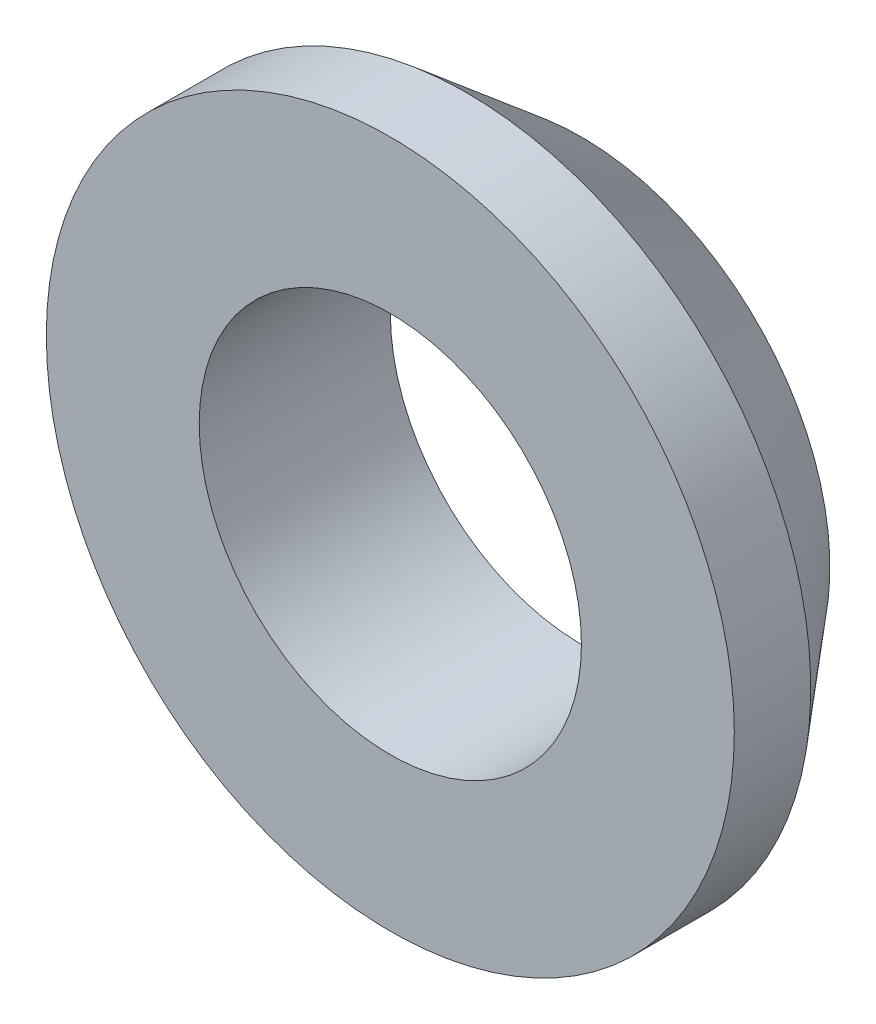
ISO-10303-21;
HEADER;
FILE_DESCRIPTION(('STEP AP214'),'2;1');
FILE_NAME('part.step','',(''),(''),'','','');
FILE_SCHEMA(('AUTOMOTIVE_DESIGN { 1 0 10303 214 1 1 1 1 }'));
ENDSEC;
DATA;
#1=APPLICATION_CONTEXT('core data for automotive mechanical design processes');
#2=APPLICATION_PROTOCOL_DEFINITION('international standard','automotive_design',2000,#1);
#3=PRODUCT_CONTEXT('',#1,'mechanical');
#4=PRODUCT('Part','Part','',(#3));
#5=PRODUCT_RELATED_PRODUCT_CATEGORY('part','',(#4));
#6=PRODUCT_DEFINITION_FORMATION('','',#4);
#7=PRODUCT_DEFINITION_CONTEXT('part definition',#1,'design');
#8=PRODUCT_DEFINITION('design','',#6,#7);
#9=PRODUCT_DEFINITION_SHAPE('','',#8);
#10=(LENGTH_UNIT() NAMED_UNIT(*) SI_UNIT(.MILLI.,.METRE.));
#11=(NAMED_UNIT(*) PLANE_ANGLE_UNIT() SI_UNIT($,.RADIAN.));
#12=(NAMED_UNIT(*) SI_UNIT($,.STERADIAN.) SOLID_ANGLE_UNIT());
#13=UNCERTAINTY_MEASURE_WITH_UNIT(LENGTH_MEASURE(1.E-05),#10,'distance_accuracy_value','');
#14=(GEOMETRIC_REPRESENTATION_CONTEXT(3) GLOBAL_UNCERTAINTY_ASSIGNED_CONTEXT((#13)) GLOBAL_UNIT_ASSIGNED_CONTEXT((#10,
#11,#12)) REPRESENTATION_CONTEXT('',''));
#15=CARTESIAN_POINT('',(0.,0.,0.));
#16=DIRECTION('',(0.,0.,1.));
#17=DIRECTION('',(1.,0.,0.));
#18=AXIS2_PLACEMENT_3D('',#15,#16,#17);
#19=CARTESIAN_POINT('',(0.,0.,2.));
#20=DIRECTION('',(0.,0.,1.));
#21=DIRECTION('',(1.,0.,0.));
#22=AXIS2_PLACEMENT_3D('',#19,#20,#21);
#23=PLANE('',#22);
#24=CARTESIAN_POINT('',(0.,0.,2.));
#25=DIRECTION('',(0.,0.,1.));
#26=DIRECTION('',(1.,0.,0.));
#27=AXIS2_PLACEMENT_3D('',#24,#25,#26);
#28=CIRCLE('',#27,9.);
#29=CARTESIAN_POINT('',(9.,0.,2.));
#30=VERTEX_POINT('',#29);
#31=EDGE_CURVE('E11',#30,#30,#28,.T.);
#32=ORIENTED_EDGE('',*,*,#31,.T.);
#33=EDGE_LOOP('',(#32));
#34=FACE_BOUND('',#33,.T.);
#35=CARTESIAN_POINT('',(0.,0.,2.));
#36=DIRECTION('',(0.,0.,1.));
#37=DIRECTION('',(1.,0.,0.));
#38=AXIS2_PLACEMENT_3D('',#35,#36,#37);
#39=CIRCLE('',#38,5.);
#40=CARTESIAN_POINT('',(5.,0.,2.));
#41=VERTEX_POINT('',#40);
#42=EDGE_CURVE('E40',#41,#41,#39,.T.);
#43=ORIENTED_EDGE('',*,*,#42,.F.);
#44=EDGE_LOOP('',(#43));
#45=FACE_BOUND('',#44,.T.);
#46=ADVANCED_FACE('F33',(#34,#45),#23,.T.);
#47=CARTESIAN_POINT('',(0.,0.,2.));
#48=DIRECTION('',(0.,0.,-1.));
#49=DIRECTION('',(-1.,0.,0.));
#50=AXIS2_PLACEMENT_3D('',#47,#48,#49);
#51=CYLINDRICAL_SURFACE('',#50,9.);
#52=ORIENTED_EDGE('',*,*,#31,.F.);
#53=EDGE_LOOP('',(#52));
#54=FACE_BOUND('',#53,.T.);
#55=CARTESIAN_POINT('',(0.,0.,0.));
#56=DIRECTION('',(0.,0.,-1.));
#57=DIRECTION('',(-1.,0.,0.));
#58=AXIS2_PLACEMENT_3D('',#55,#56,#57);
#59=CIRCLE('',#58,9.);
#60=CARTESIAN_POINT('',(-9.,0.,0.));
#61=VERTEX_POINT('',#60);
#62=EDGE_CURVE('E48',#61,#61,#59,.T.);
#63=ORIENTED_EDGE('',*,*,#62,.F.);
#64=EDGE_LOOP('',(#63));
#65=FACE_BOUND('',#64,.T.);
#66=ADVANCED_FACE('F35',(#54,#65),#51,.T.);
#67=CARTESIAN_POINT('',(0.,0.,2.));
#68=DIRECTION('',(0.,0.,-1.));
#69=DIRECTION('',(-1.,0.,0.));
#70=AXIS2_PLACEMENT_3D('',#67,#68,#69);
#71=CYLINDRICAL_SURFACE('',#70,5.);
#72=ORIENTED_EDGE('',*,*,#42,.T.);
#73=EDGE_LOOP('',(#72));
#74=FACE_BOUND('',#73,.T.);
#75=CARTESIAN_POINT('',(0.,0.,-3.));
#76=DIRECTION('',(0.,0.,-1.));
#77=DIRECTION('',(-1.,0.,0.));
#78=AXIS2_PLACEMENT_3D('',#75,#76,#77);
#79=CIRCLE('',#78,5.);
#80=CARTESIAN_POINT('',(-5.,0.,-3.));
#81=VERTEX_POINT('',#80);
#82=EDGE_CURVE('E85',#81,#81,#79,.T.);
#83=ORIENTED_EDGE('',*,*,#82,.T.);
#84=EDGE_LOOP('',(#83));
#85=FACE_BOUND('',#84,.T.);
#86=ADVANCED_FACE('F69',(#74,#85),#71,.F.);
#87=CARTESIAN_POINT('',(0.,0.,-3.));
#88=DIRECTION('',(0.,0.,-1.));
#89=DIRECTION('',(-1.,0.,0.));
#90=AXIS2_PLACEMENT_3D('',#87,#88,#89);
#91=PLANE('',#90);
#92=ORIENTED_EDGE('',*,*,#82,.F.);
#93=EDGE_LOOP('',(#92));
#94=FACE_BOUND('',#93,.T.);
#95=CARTESIAN_POINT('',(0.,0.,-3.));
#96=DIRECTION('',(0.,0.,-1.));
#97=DIRECTION('',(-1.,0.,0.));
#98=AXIS2_PLACEMENT_3D('',#95,#96,#97);
#99=CIRCLE('',#98,6.5);
#100=CARTESIAN_POINT('',(-6.5,0.,-3.));
#101=VERTEX_POINT('',#100);
#102=EDGE_CURVE('E44',#101,#101,#99,.T.);
#103=ORIENTED_EDGE('',*,*,#102,.T.);
#104=EDGE_LOOP('',(#103));
#105=FACE_BOUND('',#104,.T.);
#106=ADVANCED_FACE('F58',(#94,#105),#91,.T.);
#107=CARTESIAN_POINT('',(0.,0.,-3.));
#108=DIRECTION('',(0.,0.,1.));
#109=DIRECTION('',(1.,0.,0.));
#110=AXIS2_PLACEMENT_3D('',#107,#108,#109);
#111=CONICAL_SURFACE('',#110,6.5,0.694738276196703);
#112=ORIENTED_EDGE('',*,*,#62,.T.);
#113=EDGE_LOOP('',(#112));
#114=FACE_BOUND('',#113,.T.);
#115=ORIENTED_EDGE('',*,*,#102,.F.);
#116=EDGE_LOOP('',(#115));
#117=FACE_BOUND('',#116,.T.);
#118=ADVANCED_FACE('F68',(#114,#117),#111,.T.);
#119=CLOSED_SHELL('',(#46,#66,#86,#106,#118));
#120=MANIFOLD_SOLID_BREP('B2',#119);
#121=ADVANCED_BREP_SHAPE_REPRESENTATION('',(#18,#120),#14);
#122=SHAPE_DEFINITION_REPRESENTATION(#9,#121);
ENDSEC;
END-ISO-10303-21;
